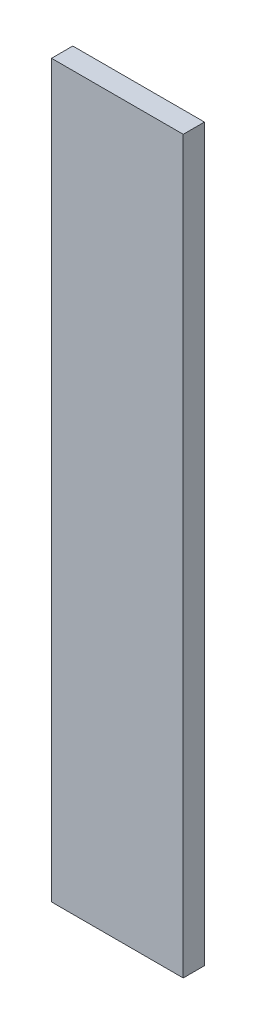
ISO-10303-21;
HEADER;
FILE_DESCRIPTION(('STEP AP214'),'2;1');
FILE_NAME('part.step','',(''),(''),'','','');
FILE_SCHEMA(('AUTOMOTIVE_DESIGN { 1 0 10303 214 1 1 1 1 }'));
ENDSEC;
DATA;
#1=APPLICATION_CONTEXT('core data for automotive mechanical design processes');
#2=APPLICATION_PROTOCOL_DEFINITION('international standard','automotive_design',2000,#1);
#3=PRODUCT_CONTEXT('',#1,'mechanical');
#4=PRODUCT('Part','Part','',(#3));
#5=PRODUCT_RELATED_PRODUCT_CATEGORY('part','',(#4));
#6=PRODUCT_DEFINITION_FORMATION('','',#4);
#7=PRODUCT_DEFINITION_CONTEXT('part definition',#1,'design');
#8=PRODUCT_DEFINITION('design','',#6,#7);
#9=PRODUCT_DEFINITION_SHAPE('','',#8);
#10=(LENGTH_UNIT() NAMED_UNIT(*) SI_UNIT(.MILLI.,.METRE.));
#11=(NAMED_UNIT(*) PLANE_ANGLE_UNIT() SI_UNIT($,.RADIAN.));
#12=(NAMED_UNIT(*) SI_UNIT($,.STERADIAN.) SOLID_ANGLE_UNIT());
#13=UNCERTAINTY_MEASURE_WITH_UNIT(LENGTH_MEASURE(1.E-05),#10,'distance_accuracy_value','');
#14=(GEOMETRIC_REPRESENTATION_CONTEXT(3) GLOBAL_UNCERTAINTY_ASSIGNED_CONTEXT((#13)) GLOBAL_UNIT_ASSIGNED_CONTEXT((#10,
#11,#12)) REPRESENTATION_CONTEXT('',''));
#15=CARTESIAN_POINT('',(0.,0.,0.));
#16=DIRECTION('',(0.,0.,1.));
#17=DIRECTION('',(1.,0.,0.));
#18=AXIS2_PLACEMENT_3D('',#15,#16,#17);
#19=CARTESIAN_POINT('',(155.,0.,25.));
#20=DIRECTION('',(0.,1.,0.));
#21=DIRECTION('',(0.,0.,-1.));
#22=AXIS2_PLACEMENT_3D('',#19,#20,#21);
#23=PLANE('',#22);
#24=DIRECTION('',(1.,0.,0.));
#25=VECTOR('',#24,1.);
#26=CARTESIAN_POINT('',(155.,0.,0.));
#27=LINE('',#26,#25);
#28=CARTESIAN_POINT('',(0.,-5.41179920971954E-13,0.));
#29=VERTEX_POINT('',#28);
#30=CARTESIAN_POINT('',(155.,0.,0.));
#31=VERTEX_POINT('',#30);
#32=EDGE_CURVE('E98',#29,#31,#27,.T.);
#33=ORIENTED_EDGE('',*,*,#32,.T.);
#34=DIRECTION('',(0.,0.,-1.));
#35=VECTOR('',#34,1.);
#36=CARTESIAN_POINT('',(155.,0.,25.));
#37=LINE('',#36,#35);
#38=CARTESIAN_POINT('',(155.,0.,25.));
#39=VERTEX_POINT('',#38);
#40=EDGE_CURVE('E11',#39,#31,#37,.T.);
#41=ORIENTED_EDGE('',*,*,#40,.F.);
#42=DIRECTION('',(1.,0.,0.));
#43=VECTOR('',#42,1.);
#44=CARTESIAN_POINT('',(155.,0.,25.));
#45=LINE('',#44,#43);
#46=CARTESIAN_POINT('',(0.,-5.41179920971954E-13,25.));
#47=VERTEX_POINT('',#46);
#48=EDGE_CURVE('E86',#47,#39,#45,.T.);
#49=ORIENTED_EDGE('',*,*,#48,.F.);
#50=DIRECTION('',(0.,0.,-1.));
#51=VECTOR('',#50,1.);
#52=CARTESIAN_POINT('',(0.,-5.41179920971954E-13,25.));
#53=LINE('',#52,#51);
#54=EDGE_CURVE('E94',#47,#29,#53,.T.);
#55=ORIENTED_EDGE('',*,*,#54,.T.);
#56=EDGE_LOOP('',(#33,#41,#49,#55));
#57=FACE_BOUND('',#56,.T.);
#58=ADVANCED_FACE('F35',(#57),#23,.F.);
#59=CARTESIAN_POINT('',(155.,0.,25.));
#60=DIRECTION('',(-1.,0.,0.));
#61=DIRECTION('',(0.,0.,1.));
#62=AXIS2_PLACEMENT_3D('',#59,#60,#61);
#63=PLANE('',#62);
#64=DIRECTION('',(0.,1.,0.));
#65=VECTOR('',#64,1.);
#66=CARTESIAN_POINT('',(155.,0.,0.));
#67=LINE('',#66,#65);
#68=CARTESIAN_POINT('',(154.999999999997,860.,0.));
#69=VERTEX_POINT('',#68);
#70=EDGE_CURVE('E90',#31,#69,#67,.T.);
#71=ORIENTED_EDGE('',*,*,#70,.T.);
#72=DIRECTION('',(0.,0.,-1.));
#73=VECTOR('',#72,1.);
#74=CARTESIAN_POINT('',(154.999999999997,860.,25.));
#75=LINE('',#74,#73);
#76=CARTESIAN_POINT('',(154.999999999997,860.,25.));
#77=VERTEX_POINT('',#76);
#78=EDGE_CURVE('E43',#77,#69,#75,.T.);
#79=ORIENTED_EDGE('',*,*,#78,.F.);
#80=DIRECTION('',(0.,1.,0.));
#81=VECTOR('',#80,1.);
#82=CARTESIAN_POINT('',(155.,0.,25.));
#83=LINE('',#82,#81);
#84=EDGE_CURVE('E81',#39,#77,#83,.T.);
#85=ORIENTED_EDGE('',*,*,#84,.F.);
#86=ORIENTED_EDGE('',*,*,#40,.T.);
#87=EDGE_LOOP('',(#71,#79,#85,#86));
#88=FACE_BOUND('',#87,.T.);
#89=ADVANCED_FACE('F89',(#88),#63,.F.);
#90=CARTESIAN_POINT('',(154.999999999997,860.,25.));
#91=DIRECTION('',(0.,-1.,0.));
#92=DIRECTION('',(0.,0.,1.));
#93=AXIS2_PLACEMENT_3D('',#90,#91,#92);
#94=PLANE('',#93);
#95=DIRECTION('',(-1.,0.,0.));
#96=VECTOR('',#95,1.);
#97=CARTESIAN_POINT('',(154.999999999997,860.,0.));
#98=LINE('',#97,#96);
#99=CARTESIAN_POINT('',(-2.99760216648792E-12,859.999999999999,0.));
#100=VERTEX_POINT('',#99);
#101=EDGE_CURVE('E68',#69,#100,#98,.T.);
#102=ORIENTED_EDGE('',*,*,#101,.T.);
#103=DIRECTION('',(0.,0.,-1.));
#104=VECTOR('',#103,1.);
#105=CARTESIAN_POINT('',(-2.99760216648792E-12,859.999999999999,25.));
#106=LINE('',#105,#104);
#107=CARTESIAN_POINT('',(-2.99760216648792E-12,859.999999999999,25.));
#108=VERTEX_POINT('',#107);
#109=EDGE_CURVE('E91',#108,#100,#106,.T.);
#110=ORIENTED_EDGE('',*,*,#109,.F.);
#111=DIRECTION('',(-1.,0.,0.));
#112=VECTOR('',#111,1.);
#113=CARTESIAN_POINT('',(154.999999999997,860.,25.));
#114=LINE('',#113,#112);
#115=EDGE_CURVE('E84',#77,#108,#114,.T.);
#116=ORIENTED_EDGE('',*,*,#115,.F.);
#117=ORIENTED_EDGE('',*,*,#78,.T.);
#118=EDGE_LOOP('',(#102,#110,#116,#117));
#119=FACE_BOUND('',#118,.T.);
#120=ADVANCED_FACE('F92',(#119),#94,.F.);
#121=CARTESIAN_POINT('',(0.,-5.41179920971954E-13,25.));
#122=DIRECTION('',(1.,0.,0.));
#123=DIRECTION('',(0.,0.,-1.));
#124=AXIS2_PLACEMENT_3D('',#121,#122,#123);
#125=PLANE('',#124);
#126=DIRECTION('',(0.,-1.,0.));
#127=VECTOR('',#126,1.);
#128=CARTESIAN_POINT('',(0.,-5.41179920971954E-13,0.));
#129=LINE('',#128,#127);
#130=EDGE_CURVE('E74',#100,#29,#129,.T.);
#131=ORIENTED_EDGE('',*,*,#130,.T.);
#132=ORIENTED_EDGE('',*,*,#54,.F.);
#133=DIRECTION('',(0.,-1.,0.));
#134=VECTOR('',#133,1.);
#135=CARTESIAN_POINT('',(0.,-5.41179920971954E-13,25.));
#136=LINE('',#135,#134);
#137=EDGE_CURVE('E51',#108,#47,#136,.T.);
#138=ORIENTED_EDGE('',*,*,#137,.F.);
#139=ORIENTED_EDGE('',*,*,#109,.T.);
#140=EDGE_LOOP('',(#131,#132,#138,#139));
#141=FACE_BOUND('',#140,.T.);
#142=ADVANCED_FACE('F105',(#141),#125,.F.);
#143=CARTESIAN_POINT('',(155.,0.,25.));
#144=DIRECTION('',(0.,0.,-1.));
#145=DIRECTION('',(0.,-1.,0.));
#146=AXIS2_PLACEMENT_3D('',#143,#144,#145);
#147=PLANE('',#146);
#148=ORIENTED_EDGE('',*,*,#48,.T.);
#149=ORIENTED_EDGE('',*,*,#84,.T.);
#150=ORIENTED_EDGE('',*,*,#115,.T.);
#151=ORIENTED_EDGE('',*,*,#137,.T.);
#152=EDGE_LOOP('',(#148,#149,#150,#151));
#153=FACE_BOUND('',#152,.T.);
#154=ADVANCED_FACE('F82',(#153),#147,.F.);
#155=CARTESIAN_POINT('',(155.,0.,0.));
#156=DIRECTION('',(0.,0.,-1.));
#157=DIRECTION('',(0.,-1.,0.));
#158=AXIS2_PLACEMENT_3D('',#155,#156,#157);
#159=PLANE('',#158);
#160=ORIENTED_EDGE('',*,*,#32,.F.);
#161=ORIENTED_EDGE('',*,*,#130,.F.);
#162=ORIENTED_EDGE('',*,*,#101,.F.);
#163=ORIENTED_EDGE('',*,*,#70,.F.);
#164=EDGE_LOOP('',(#160,#161,#162,#163));
#165=FACE_BOUND('',#164,.T.);
#166=ADVANCED_FACE('F108',(#165),#159,.T.);
#167=CLOSED_SHELL('',(#58,#89,#120,#142,#154,#166));
#168=MANIFOLD_SOLID_BREP('B2',#167);
#169=ADVANCED_BREP_SHAPE_REPRESENTATION('',(#18,#168),#14);
#170=SHAPE_DEFINITION_REPRESENTATION(#9,#169);
ENDSEC;
END-ISO-10303-21;
